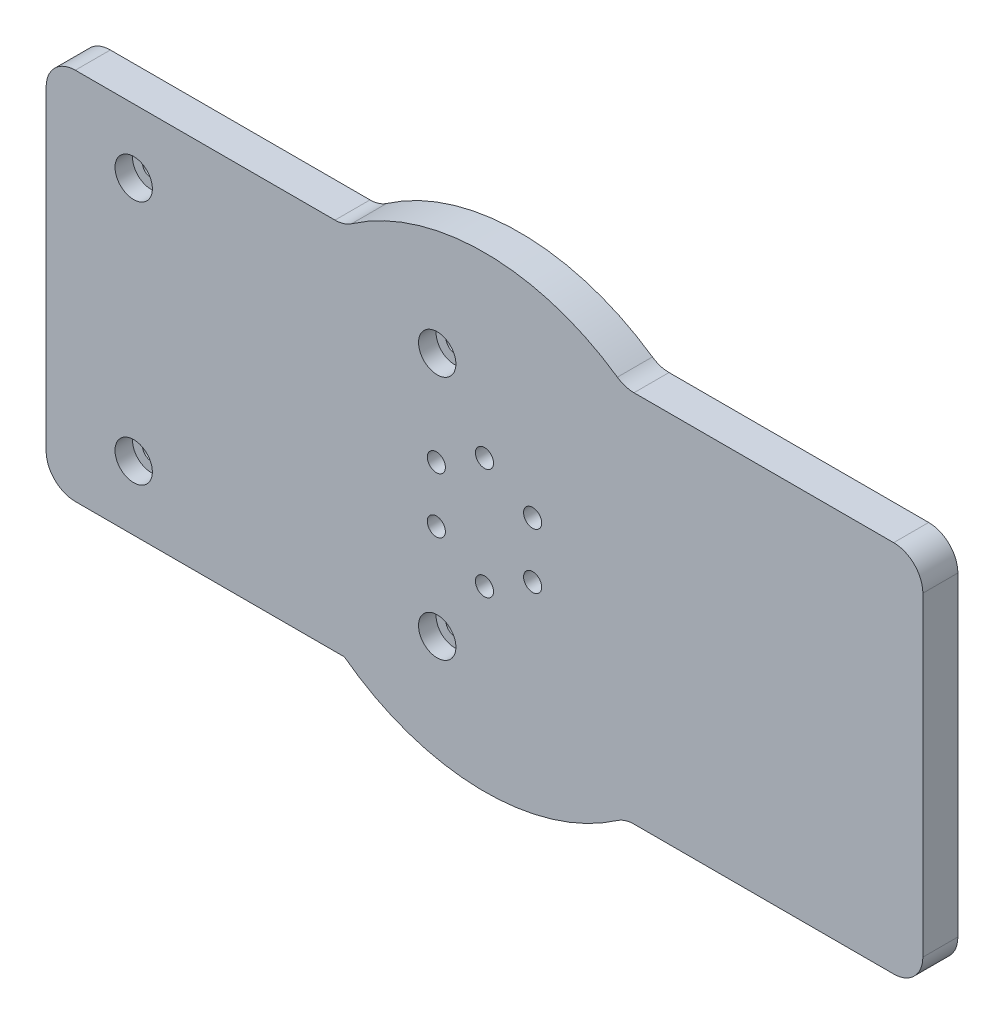
ISO-10303-21;
HEADER;
FILE_DESCRIPTION(('STEP AP214'),'2;1');
FILE_NAME('part.step','',(''),(''),'','','');
FILE_SCHEMA(('AUTOMOTIVE_DESIGN { 1 0 10303 214 1 1 1 1 }'));
ENDSEC;
DATA;
#1=APPLICATION_CONTEXT('core data for automotive mechanical design processes');
#2=APPLICATION_PROTOCOL_DEFINITION('international standard','automotive_design',2000,#1);
#3=PRODUCT_CONTEXT('',#1,'mechanical');
#4=PRODUCT('Part','Part','',(#3));
#5=PRODUCT_RELATED_PRODUCT_CATEGORY('part','',(#4));
#6=PRODUCT_DEFINITION_FORMATION('','',#4);
#7=PRODUCT_DEFINITION_CONTEXT('part definition',#1,'design');
#8=PRODUCT_DEFINITION('design','',#6,#7);
#9=PRODUCT_DEFINITION_SHAPE('','',#8);
#10=(LENGTH_UNIT() NAMED_UNIT(*) SI_UNIT(.MILLI.,.METRE.));
#11=(NAMED_UNIT(*) PLANE_ANGLE_UNIT() SI_UNIT($,.RADIAN.));
#12=(NAMED_UNIT(*) SI_UNIT($,.STERADIAN.) SOLID_ANGLE_UNIT());
#13=UNCERTAINTY_MEASURE_WITH_UNIT(LENGTH_MEASURE(1.E-05),#10,'distance_accuracy_value','');
#14=(GEOMETRIC_REPRESENTATION_CONTEXT(3) GLOBAL_UNCERTAINTY_ASSIGNED_CONTEXT((#13)) GLOBAL_UNIT_ASSIGNED_CONTEXT((#10,
#11,#12)) REPRESENTATION_CONTEXT('',''));
#15=CARTESIAN_POINT('',(0.,0.,0.));
#16=DIRECTION('',(0.,0.,1.));
#17=DIRECTION('',(1.,0.,0.));
#18=AXIS2_PLACEMENT_3D('',#15,#16,#17);
#19=CARTESIAN_POINT('',(15.,53.,0.));
#20=DIRECTION('',(0.,0.,1.));
#21=DIRECTION('',(1.,0.,0.));
#22=AXIS2_PLACEMENT_3D('',#19,#20,#21);
#23=CYLINDRICAL_SURFACE('',#22,1.5);
#24=CARTESIAN_POINT('',(15.,53.,0.));
#25=DIRECTION('',(0.,0.,1.));
#26=DIRECTION('',(1.,0.,0.));
#27=AXIS2_PLACEMENT_3D('',#24,#25,#26);
#28=CIRCLE('',#27,1.5);
#29=CARTESIAN_POINT('',(16.5,53.,0.));
#30=VERTEX_POINT('',#29);
#31=EDGE_CURVE('E176',#30,#30,#28,.T.);
#32=ORIENTED_EDGE('',*,*,#31,.F.);
#33=EDGE_LOOP('',(#32));
#34=FACE_BOUND('',#33,.T.);
#35=CARTESIAN_POINT('',(15.,53.,3.));
#36=DIRECTION('',(0.,0.,1.));
#37=DIRECTION('',(1.,0.,0.));
#38=AXIS2_PLACEMENT_3D('',#35,#36,#37);
#39=CIRCLE('',#38,1.5);
#40=CARTESIAN_POINT('',(16.5,53.,3.));
#41=VERTEX_POINT('',#40);
#42=EDGE_CURVE('E44',#41,#41,#39,.F.);
#43=ORIENTED_EDGE('',*,*,#42,.F.);
#44=EDGE_LOOP('',(#43));
#45=FACE_BOUND('',#44,.T.);
#46=ADVANCED_FACE('F40',(#34,#45),#23,.F.);
#47=CARTESIAN_POINT('',(15.,11.,0.));
#48=DIRECTION('',(0.,0.,1.));
#49=DIRECTION('',(1.,0.,0.));
#50=AXIS2_PLACEMENT_3D('',#47,#48,#49);
#51=CYLINDRICAL_SURFACE('',#50,1.5);
#52=CARTESIAN_POINT('',(15.,11.,0.));
#53=DIRECTION('',(0.,0.,1.));
#54=DIRECTION('',(1.,0.,0.));
#55=AXIS2_PLACEMENT_3D('',#52,#53,#54);
#56=CIRCLE('',#55,1.5);
#57=CARTESIAN_POINT('',(16.5,11.,0.));
#58=VERTEX_POINT('',#57);
#59=EDGE_CURVE('E173',#58,#58,#56,.T.);
#60=ORIENTED_EDGE('',*,*,#59,.F.);
#61=EDGE_LOOP('',(#60));
#62=FACE_BOUND('',#61,.T.);
#63=CARTESIAN_POINT('',(15.,11.,3.));
#64=DIRECTION('',(0.,0.,1.));
#65=DIRECTION('',(1.,0.,0.));
#66=AXIS2_PLACEMENT_3D('',#63,#64,#65);
#67=CIRCLE('',#66,1.5);
#68=CARTESIAN_POINT('',(16.5,11.,3.));
#69=VERTEX_POINT('',#68);
#70=EDGE_CURVE('E306',#69,#69,#67,.F.);
#71=ORIENTED_EDGE('',*,*,#70,.F.);
#72=EDGE_LOOP('',(#71));
#73=FACE_BOUND('',#72,.T.);
#74=ADVANCED_FACE('F393',(#62,#73),#51,.F.);
#75=CARTESIAN_POINT('',(67.,11.,0.));
#76=DIRECTION('',(0.,0.,1.));
#77=DIRECTION('',(1.,0.,0.));
#78=AXIS2_PLACEMENT_3D('',#75,#76,#77);
#79=CYLINDRICAL_SURFACE('',#78,1.5);
#80=CARTESIAN_POINT('',(67.,11.,0.));
#81=DIRECTION('',(0.,0.,1.));
#82=DIRECTION('',(1.,0.,0.));
#83=AXIS2_PLACEMENT_3D('',#80,#81,#82);
#84=CIRCLE('',#83,1.5);
#85=CARTESIAN_POINT('',(68.5,11.,0.));
#86=VERTEX_POINT('',#85);
#87=EDGE_CURVE('E311',#86,#86,#84,.T.);
#88=ORIENTED_EDGE('',*,*,#87,.F.);
#89=EDGE_LOOP('',(#88));
#90=FACE_BOUND('',#89,.T.);
#91=CARTESIAN_POINT('',(67.,11.,3.));
#92=DIRECTION('',(0.,0.,1.));
#93=DIRECTION('',(1.,0.,0.));
#94=AXIS2_PLACEMENT_3D('',#91,#92,#93);
#95=CIRCLE('',#94,1.5);
#96=CARTESIAN_POINT('',(68.5,11.,3.));
#97=VERTEX_POINT('',#96);
#98=EDGE_CURVE('E303',#97,#97,#95,.F.);
#99=ORIENTED_EDGE('',*,*,#98,.F.);
#100=EDGE_LOOP('',(#99));
#101=FACE_BOUND('',#100,.T.);
#102=ADVANCED_FACE('F400',(#90,#101),#79,.F.);
#103=CARTESIAN_POINT('',(67.,53.,0.));
#104=DIRECTION('',(0.,0.,1.));
#105=DIRECTION('',(1.,0.,0.));
#106=AXIS2_PLACEMENT_3D('',#103,#104,#105);
#107=CYLINDRICAL_SURFACE('',#106,1.5);
#108=CARTESIAN_POINT('',(67.,53.,0.));
#109=DIRECTION('',(0.,0.,1.));
#110=DIRECTION('',(1.,0.,0.));
#111=AXIS2_PLACEMENT_3D('',#108,#109,#110);
#112=CIRCLE('',#111,1.5);
#113=CARTESIAN_POINT('',(68.5,53.,0.));
#114=VERTEX_POINT('',#113);
#115=EDGE_CURVE('E315',#114,#114,#112,.T.);
#116=ORIENTED_EDGE('',*,*,#115,.F.);
#117=EDGE_LOOP('',(#116));
#118=FACE_BOUND('',#117,.T.);
#119=CARTESIAN_POINT('',(67.,53.,3.));
#120=DIRECTION('',(0.,0.,1.));
#121=DIRECTION('',(1.,0.,0.));
#122=AXIS2_PLACEMENT_3D('',#119,#120,#121);
#123=CIRCLE('',#122,1.5);
#124=CARTESIAN_POINT('',(68.5,53.,3.));
#125=VERTEX_POINT('',#124);
#126=EDGE_CURVE('E300',#125,#125,#123,.F.);
#127=ORIENTED_EDGE('',*,*,#126,.F.);
#128=EDGE_LOOP('',(#127));
#129=FACE_BOUND('',#128,.T.);
#130=ADVANCED_FACE('F453',(#118,#129),#107,.F.);
#131=CARTESIAN_POINT('',(0.,0.,6.));
#132=DIRECTION('',(1.,0.,0.));
#133=DIRECTION('',(0.,0.,-1.));
#134=AXIS2_PLACEMENT_3D('',#131,#132,#133);
#135=PLANE('',#134);
#136=DIRECTION('',(0.,-1.,0.));
#137=VECTOR('',#136,1.);
#138=CARTESIAN_POINT('',(0.,0.,0.));
#139=LINE('',#138,#137);
#140=CARTESIAN_POINT('',(0.,59.,0.));
#141=VERTEX_POINT('',#140);
#142=CARTESIAN_POINT('',(0.,5.,0.));
#143=VERTEX_POINT('',#142);
#144=EDGE_CURVE('E231',#141,#143,#139,.T.);
#145=ORIENTED_EDGE('',*,*,#144,.T.);
#146=DIRECTION('',(0.,0.,-1.));
#147=VECTOR('',#146,1.);
#148=CARTESIAN_POINT('',(0.,5.,6.));
#149=LINE('',#148,#147);
#150=CARTESIAN_POINT('',(0.,5.,6.));
#151=VERTEX_POINT('',#150);
#152=EDGE_CURVE('E49',#143,#151,#149,.F.);
#153=ORIENTED_EDGE('',*,*,#152,.T.);
#154=DIRECTION('',(0.,-1.,0.));
#155=VECTOR('',#154,1.);
#156=CARTESIAN_POINT('',(0.,0.,6.));
#157=LINE('',#156,#155);
#158=CARTESIAN_POINT('',(0.,59.,6.));
#159=VERTEX_POINT('',#158);
#160=EDGE_CURVE('E218',#159,#151,#157,.T.);
#161=ORIENTED_EDGE('',*,*,#160,.F.);
#162=DIRECTION('',(0.,0.,-1.));
#163=VECTOR('',#162,1.);
#164=CARTESIAN_POINT('',(0.,59.,6.));
#165=LINE('',#164,#163);
#166=EDGE_CURVE('E268',#159,#141,#165,.T.);
#167=ORIENTED_EDGE('',*,*,#166,.T.);
#168=EDGE_LOOP('',(#145,#153,#161,#167));
#169=FACE_BOUND('',#168,.T.);
#170=ADVANCED_FACE('F359',(#169),#135,.F.);
#171=CARTESIAN_POINT('',(0.,0.,6.));
#172=DIRECTION('',(0.,0.,-1.));
#173=DIRECTION('',(-1.,0.,0.));
#174=AXIS2_PLACEMENT_3D('',#171,#172,#173);
#175=PLANE('',#174);
#176=CARTESIAN_POINT('',(67.,53.,6.));
#177=DIRECTION('',(0.,0.,1.));
#178=DIRECTION('',(1.,0.,0.));
#179=AXIS2_PLACEMENT_3D('',#176,#177,#178);
#180=CIRCLE('',#179,3.2);
#181=CARTESIAN_POINT('',(70.2,53.,6.));
#182=VERTEX_POINT('',#181);
#183=EDGE_CURVE('E335',#182,#182,#180,.T.);
#184=ORIENTED_EDGE('',*,*,#183,.F.);
#185=EDGE_LOOP('',(#184));
#186=FACE_BOUND('',#185,.T.);
#187=CARTESIAN_POINT('',(15.,11.,6.));
#188=DIRECTION('',(0.,0.,1.));
#189=DIRECTION('',(1.,0.,0.));
#190=AXIS2_PLACEMENT_3D('',#187,#188,#189);
#191=CIRCLE('',#190,3.2);
#192=CARTESIAN_POINT('',(18.2,11.,6.));
#193=VERTEX_POINT('',#192);
#194=EDGE_CURVE('E328',#193,#193,#191,.T.);
#195=ORIENTED_EDGE('',*,*,#194,.F.);
#196=EDGE_LOOP('',(#195));
#197=FACE_BOUND('',#196,.T.);
#198=CARTESIAN_POINT('',(67.,11.,6.));
#199=DIRECTION('',(0.,0.,1.));
#200=DIRECTION('',(1.,0.,0.));
#201=AXIS2_PLACEMENT_3D('',#198,#199,#200);
#202=CIRCLE('',#201,3.2);
#203=CARTESIAN_POINT('',(70.2,11.,6.));
#204=VERTEX_POINT('',#203);
#205=EDGE_CURVE('E340',#204,#204,#202,.T.);
#206=ORIENTED_EDGE('',*,*,#205,.F.);
#207=EDGE_LOOP('',(#206));
#208=FACE_BOUND('',#207,.T.);
#209=CARTESIAN_POINT('',(15.,53.,6.));
#210=DIRECTION('',(0.,0.,1.));
#211=DIRECTION('',(1.,0.,0.));
#212=AXIS2_PLACEMENT_3D('',#209,#210,#211);
#213=CIRCLE('',#212,3.2);
#214=CARTESIAN_POINT('',(18.2,53.,6.));
#215=VERTEX_POINT('',#214);
#216=EDGE_CURVE('E322',#215,#215,#213,.T.);
#217=ORIENTED_EDGE('',*,*,#216,.F.);
#218=EDGE_LOOP('',(#217));
#219=FACE_BOUND('',#218,.T.);
#220=CARTESIAN_POINT('',(83.348891971047,36.7625000000003,6.));
#221=DIRECTION('',(0.,0.,1.));
#222=DIRECTION('',(1.,0.,0.));
#223=AXIS2_PLACEMENT_3D('',#220,#221,#222);
#224=CIRCLE('',#223,1.55);
#225=CARTESIAN_POINT('',(84.898891971047,36.7625000000003,6.));
#226=VERTEX_POINT('',#225);
#227=EDGE_CURVE('E197',#226,#226,#224,.T.);
#228=ORIENTED_EDGE('',*,*,#227,.F.);
#229=EDGE_LOOP('',(#228));
#230=FACE_BOUND('',#229,.T.);
#231=CARTESIAN_POINT('',(83.3488919710474,27.2375000000003,6.));
#232=DIRECTION('',(0.,0.,1.));
#233=DIRECTION('',(1.,0.,0.));
#234=AXIS2_PLACEMENT_3D('',#231,#232,#233);
#235=CIRCLE('',#234,1.55);
#236=CARTESIAN_POINT('',(84.8988919710474,27.2375000000003,6.));
#237=VERTEX_POINT('',#236);
#238=EDGE_CURVE('E203',#237,#237,#235,.T.);
#239=ORIENTED_EDGE('',*,*,#238,.F.);
#240=EDGE_LOOP('',(#239));
#241=FACE_BOUND('',#240,.T.);
#242=CARTESIAN_POINT('',(75.1000000000007,22.475,6.));
#243=DIRECTION('',(0.,0.,1.));
#244=DIRECTION('',(1.,0.,0.));
#245=AXIS2_PLACEMENT_3D('',#242,#243,#244);
#246=CIRCLE('',#245,1.54999999999999);
#247=CARTESIAN_POINT('',(76.6500000000007,22.475,6.));
#248=VERTEX_POINT('',#247);
#249=EDGE_CURVE('E209',#248,#248,#246,.T.);
#250=ORIENTED_EDGE('',*,*,#249,.F.);
#251=EDGE_LOOP('',(#250));
#252=FACE_BOUND('',#251,.T.);
#253=CARTESIAN_POINT('',(66.8511080289538,27.2374999999997,6.));
#254=DIRECTION('',(0.,0.,1.));
#255=DIRECTION('',(1.,0.,0.));
#256=AXIS2_PLACEMENT_3D('',#253,#254,#255);
#257=CIRCLE('',#256,1.54999999999999);
#258=CARTESIAN_POINT('',(68.4011080289538,27.2374999999997,6.));
#259=VERTEX_POINT('',#258);
#260=EDGE_CURVE('E192',#259,#259,#257,.T.);
#261=ORIENTED_EDGE('',*,*,#260,.F.);
#262=EDGE_LOOP('',(#261));
#263=FACE_BOUND('',#262,.T.);
#264=CARTESIAN_POINT('',(66.8511080289535,36.7624999999998,6.));
#265=DIRECTION('',(0.,0.,1.));
#266=DIRECTION('',(1.,0.,0.));
#267=AXIS2_PLACEMENT_3D('',#264,#265,#266);
#268=CIRCLE('',#267,1.55);
#269=CARTESIAN_POINT('',(68.4011080289535,36.7624999999998,6.));
#270=VERTEX_POINT('',#269);
#271=EDGE_CURVE('E181',#270,#270,#268,.T.);
#272=ORIENTED_EDGE('',*,*,#271,.F.);
#273=EDGE_LOOP('',(#272));
#274=FACE_BOUND('',#273,.T.);
#275=CARTESIAN_POINT('',(75.1,41.525,6.));
#276=DIRECTION('',(0.,0.,1.));
#277=DIRECTION('',(1.,0.,0.));
#278=AXIS2_PLACEMENT_3D('',#275,#276,#277);
#279=CIRCLE('',#278,1.54999999999999);
#280=CARTESIAN_POINT('',(76.65,41.525,6.));
#281=VERTEX_POINT('',#280);
#282=EDGE_CURVE('E185',#281,#281,#279,.T.);
#283=ORIENTED_EDGE('',*,*,#282,.F.);
#284=EDGE_LOOP('',(#283));
#285=FACE_BOUND('',#284,.T.);
#286=ORIENTED_EDGE('',*,*,#160,.T.);
#287=CARTESIAN_POINT('',(5.,5.,6.));
#288=DIRECTION('',(0.,0.,-1.));
#289=DIRECTION('',(-1.,0.,0.));
#290=AXIS2_PLACEMENT_3D('',#287,#288,#289);
#291=CIRCLE('',#290,5.);
#292=CARTESIAN_POINT('',(5.,0.,6.));
#293=VERTEX_POINT('',#292);
#294=EDGE_CURVE('E11',#151,#293,#291,.F.);
#295=ORIENTED_EDGE('',*,*,#294,.T.);
#296=DIRECTION('',(-1.,0.,0.));
#297=VECTOR('',#296,1.);
#298=CARTESIAN_POINT('',(0.,0.,6.));
#299=LINE('',#298,#297);
#300=CARTESIAN_POINT('',(51.1,0.,6.));
#301=VERTEX_POINT('',#300);
#302=EDGE_CURVE('E167',#301,#293,#299,.T.);
#303=ORIENTED_EDGE('',*,*,#302,.F.);
#304=CARTESIAN_POINT('',(75.1,32.,6.));
#305=DIRECTION('',(0.,0.,1.));
#306=DIRECTION('',(1.,0.,0.));
#307=AXIS2_PLACEMENT_3D('',#304,#305,#306);
#308=CIRCLE('',#307,40.);
#309=CARTESIAN_POINT('',(97.8666639553168,-0.888888888888897,6.));
#310=VERTEX_POINT('',#309);
#311=EDGE_CURVE('E163',#301,#310,#308,.T.);
#312=ORIENTED_EDGE('',*,*,#311,.T.);
#313=CARTESIAN_POINT('',(100.712496949731,-5.,6.));
#314=DIRECTION('',(0.,0.,-1.));
#315=DIRECTION('',(-1.,0.,0.));
#316=AXIS2_PLACEMENT_3D('',#313,#314,#315);
#317=CIRCLE('',#316,5.);
#318=CARTESIAN_POINT('',(100.712496949731,0.,6.));
#319=VERTEX_POINT('',#318);
#320=EDGE_CURVE('E295',#310,#319,#317,.T.);
#321=ORIENTED_EDGE('',*,*,#320,.T.);
#322=DIRECTION('',(1.,0.,0.));
#323=VECTOR('',#322,1.);
#324=CARTESIAN_POINT('',(0.,0.,6.));
#325=LINE('',#324,#323);
#326=CARTESIAN_POINT('',(145.2,0.,6.));
#327=VERTEX_POINT('',#326);
#328=EDGE_CURVE('E220',#319,#327,#325,.T.);
#329=ORIENTED_EDGE('',*,*,#328,.T.);
#330=CARTESIAN_POINT('',(145.2,5.,6.));
#331=DIRECTION('',(0.,0.,-1.));
#332=DIRECTION('',(-1.,0.,0.));
#333=AXIS2_PLACEMENT_3D('',#330,#331,#332);
#334=CIRCLE('',#333,5.);
#335=CARTESIAN_POINT('',(150.2,5.,6.));
#336=VERTEX_POINT('',#335);
#337=EDGE_CURVE('E260',#327,#336,#334,.F.);
#338=ORIENTED_EDGE('',*,*,#337,.T.);
#339=DIRECTION('',(0.,1.,0.));
#340=VECTOR('',#339,1.);
#341=CARTESIAN_POINT('',(150.2,0.,6.));
#342=LINE('',#341,#340);
#343=CARTESIAN_POINT('',(150.2,59.,6.));
#344=VERTEX_POINT('',#343);
#345=EDGE_CURVE('E223',#336,#344,#342,.T.);
#346=ORIENTED_EDGE('',*,*,#345,.T.);
#347=CARTESIAN_POINT('',(145.2,59.,6.));
#348=DIRECTION('',(0.,0.,-1.));
#349=DIRECTION('',(-1.,0.,0.));
#350=AXIS2_PLACEMENT_3D('',#347,#348,#349);
#351=CIRCLE('',#350,5.);
#352=CARTESIAN_POINT('',(145.2,64.,6.));
#353=VERTEX_POINT('',#352);
#354=EDGE_CURVE('E258',#344,#353,#351,.F.);
#355=ORIENTED_EDGE('',*,*,#354,.T.);
#356=DIRECTION('',(-1.,0.,0.));
#357=VECTOR('',#356,1.);
#358=CARTESIAN_POINT('',(0.,64.,6.));
#359=LINE('',#358,#357);
#360=CARTESIAN_POINT('',(100.712496949731,64.,6.));
#361=VERTEX_POINT('',#360);
#362=EDGE_CURVE('E227',#353,#361,#359,.T.);
#363=ORIENTED_EDGE('',*,*,#362,.T.);
#364=CARTESIAN_POINT('',(100.712496949731,69.,6.));
#365=DIRECTION('',(0.,0.,-1.));
#366=DIRECTION('',(-1.,0.,0.));
#367=AXIS2_PLACEMENT_3D('',#364,#365,#366);
#368=CIRCLE('',#367,5.);
#369=CARTESIAN_POINT('',(97.8666639553168,64.8888888888889,6.));
#370=VERTEX_POINT('',#369);
#371=EDGE_CURVE('E290',#361,#370,#368,.T.);
#372=ORIENTED_EDGE('',*,*,#371,.T.);
#373=CARTESIAN_POINT('',(52.3333360446832,64.8888888888889,6.));
#374=VERTEX_POINT('',#373);
#375=EDGE_CURVE('E157',#370,#374,#308,.T.);
#376=ORIENTED_EDGE('',*,*,#375,.T.);
#377=CARTESIAN_POINT('',(49.4875030502686,69.,6.));
#378=DIRECTION('',(0.,0.,-1.));
#379=DIRECTION('',(-1.,0.,0.));
#380=AXIS2_PLACEMENT_3D('',#377,#378,#379);
#381=CIRCLE('',#380,5.);
#382=CARTESIAN_POINT('',(49.4875030502686,64.,6.));
#383=VERTEX_POINT('',#382);
#384=EDGE_CURVE('E288',#374,#383,#381,.T.);
#385=ORIENTED_EDGE('',*,*,#384,.T.);
#386=CARTESIAN_POINT('',(5.,64.,6.));
#387=VERTEX_POINT('',#386);
#388=EDGE_CURVE('E226',#383,#387,#359,.T.);
#389=ORIENTED_EDGE('',*,*,#388,.T.);
#390=CARTESIAN_POINT('',(5.,59.,6.));
#391=DIRECTION('',(0.,0.,-1.));
#392=DIRECTION('',(-1.,0.,0.));
#393=AXIS2_PLACEMENT_3D('',#390,#391,#392);
#394=CIRCLE('',#393,5.);
#395=EDGE_CURVE('E256',#387,#159,#394,.F.);
#396=ORIENTED_EDGE('',*,*,#395,.T.);
#397=EDGE_LOOP('',(#286,#295,#303,#312,#321,#329,#338,#346,#355,#363,#372,#376,#385,#389,#396));
#398=FACE_BOUND('',#397,.T.);
#399=ADVANCED_FACE('F356',(#186,#197,#208,#219,#230,#241,#252,#263,#274,#285,#398),#175,.F.);
#400=CARTESIAN_POINT('',(0.,0.,0.));
#401=DIRECTION('',(0.,0.,-1.));
#402=DIRECTION('',(-1.,0.,0.));
#403=AXIS2_PLACEMENT_3D('',#400,#401,#402);
#404=PLANE('',#403);
#405=ORIENTED_EDGE('',*,*,#115,.T.);
#406=EDGE_LOOP('',(#405));
#407=FACE_BOUND('',#406,.T.);
#408=ORIENTED_EDGE('',*,*,#87,.T.);
#409=EDGE_LOOP('',(#408));
#410=FACE_BOUND('',#409,.T.);
#411=ORIENTED_EDGE('',*,*,#59,.T.);
#412=EDGE_LOOP('',(#411));
#413=FACE_BOUND('',#412,.T.);
#414=ORIENTED_EDGE('',*,*,#31,.T.);
#415=EDGE_LOOP('',(#414));
#416=FACE_BOUND('',#415,.T.);
#417=CARTESIAN_POINT('',(75.1,41.525,0.));
#418=DIRECTION('',(0.,0.,1.));
#419=DIRECTION('',(1.,0.,0.));
#420=AXIS2_PLACEMENT_3D('',#417,#418,#419);
#421=CIRCLE('',#420,1.54999999999999);
#422=CARTESIAN_POINT('',(76.65,41.525,0.));
#423=VERTEX_POINT('',#422);
#424=EDGE_CURVE('E182',#423,#423,#421,.T.);
#425=ORIENTED_EDGE('',*,*,#424,.T.);
#426=EDGE_LOOP('',(#425));
#427=FACE_BOUND('',#426,.T.);
#428=CARTESIAN_POINT('',(66.8511080289535,36.7624999999998,0.));
#429=DIRECTION('',(0.,0.,1.));
#430=DIRECTION('',(1.,0.,0.));
#431=AXIS2_PLACEMENT_3D('',#428,#429,#430);
#432=CIRCLE('',#431,1.55);
#433=CARTESIAN_POINT('',(68.4011080289535,36.7624999999998,0.));
#434=VERTEX_POINT('',#433);
#435=EDGE_CURVE('E189',#434,#434,#432,.T.);
#436=ORIENTED_EDGE('',*,*,#435,.T.);
#437=EDGE_LOOP('',(#436));
#438=FACE_BOUND('',#437,.T.);
#439=CARTESIAN_POINT('',(66.8511080289538,27.2374999999997,0.));
#440=DIRECTION('',(0.,0.,1.));
#441=DIRECTION('',(1.,0.,0.));
#442=AXIS2_PLACEMENT_3D('',#439,#440,#441);
#443=CIRCLE('',#442,1.54999999999999);
#444=CARTESIAN_POINT('',(68.4011080289538,27.2374999999997,0.));
#445=VERTEX_POINT('',#444);
#446=EDGE_CURVE('E212',#445,#445,#443,.T.);
#447=ORIENTED_EDGE('',*,*,#446,.T.);
#448=EDGE_LOOP('',(#447));
#449=FACE_BOUND('',#448,.T.);
#450=CARTESIAN_POINT('',(75.1000000000007,22.475,0.));
#451=DIRECTION('',(0.,0.,1.));
#452=DIRECTION('',(1.,0.,0.));
#453=AXIS2_PLACEMENT_3D('',#450,#451,#452);
#454=CIRCLE('',#453,1.54999999999999);
#455=CARTESIAN_POINT('',(76.6500000000007,22.475,0.));
#456=VERTEX_POINT('',#455);
#457=EDGE_CURVE('E206',#456,#456,#454,.T.);
#458=ORIENTED_EDGE('',*,*,#457,.T.);
#459=EDGE_LOOP('',(#458));
#460=FACE_BOUND('',#459,.T.);
#461=CARTESIAN_POINT('',(83.3488919710474,27.2375000000003,0.));
#462=DIRECTION('',(0.,0.,1.));
#463=DIRECTION('',(1.,0.,0.));
#464=AXIS2_PLACEMENT_3D('',#461,#462,#463);
#465=CIRCLE('',#464,1.55);
#466=CARTESIAN_POINT('',(84.8988919710474,27.2375000000003,0.));
#467=VERTEX_POINT('',#466);
#468=EDGE_CURVE('E200',#467,#467,#465,.T.);
#469=ORIENTED_EDGE('',*,*,#468,.T.);
#470=EDGE_LOOP('',(#469));
#471=FACE_BOUND('',#470,.T.);
#472=CARTESIAN_POINT('',(83.348891971047,36.7625000000003,0.));
#473=DIRECTION('',(0.,0.,1.));
#474=DIRECTION('',(1.,0.,0.));
#475=AXIS2_PLACEMENT_3D('',#472,#473,#474);
#476=CIRCLE('',#475,1.55);
#477=CARTESIAN_POINT('',(84.898891971047,36.7625000000003,0.));
#478=VERTEX_POINT('',#477);
#479=EDGE_CURVE('E188',#478,#478,#476,.T.);
#480=ORIENTED_EDGE('',*,*,#479,.T.);
#481=EDGE_LOOP('',(#480));
#482=FACE_BOUND('',#481,.T.);
#483=DIRECTION('',(-1.,0.,0.));
#484=VECTOR('',#483,1.);
#485=CARTESIAN_POINT('',(0.,0.,0.));
#486=LINE('',#485,#484);
#487=CARTESIAN_POINT('',(51.1,0.,0.));
#488=VERTEX_POINT('',#487);
#489=CARTESIAN_POINT('',(5.,0.,0.));
#490=VERTEX_POINT('',#489);
#491=EDGE_CURVE('E151',#488,#490,#486,.T.);
#492=ORIENTED_EDGE('',*,*,#491,.T.);
#493=CARTESIAN_POINT('',(5.,5.,0.));
#494=DIRECTION('',(0.,0.,-1.));
#495=DIRECTION('',(-1.,0.,0.));
#496=AXIS2_PLACEMENT_3D('',#493,#494,#495);
#497=CIRCLE('',#496,5.);
#498=EDGE_CURVE('E64',#490,#143,#497,.T.);
#499=ORIENTED_EDGE('',*,*,#498,.T.);
#500=ORIENTED_EDGE('',*,*,#144,.F.);
#501=CARTESIAN_POINT('',(5.,59.,0.));
#502=DIRECTION('',(0.,0.,-1.));
#503=DIRECTION('',(-1.,0.,0.));
#504=AXIS2_PLACEMENT_3D('',#501,#502,#503);
#505=CIRCLE('',#504,5.);
#506=CARTESIAN_POINT('',(5.,64.,0.));
#507=VERTEX_POINT('',#506);
#508=EDGE_CURVE('E245',#141,#507,#505,.T.);
#509=ORIENTED_EDGE('',*,*,#508,.T.);
#510=DIRECTION('',(-1.,0.,0.));
#511=VECTOR('',#510,1.);
#512=CARTESIAN_POINT('',(0.,64.,0.));
#513=LINE('',#512,#511);
#514=CARTESIAN_POINT('',(49.4875030502686,64.,0.));
#515=VERTEX_POINT('',#514);
#516=EDGE_CURVE('E238',#515,#507,#513,.T.);
#517=ORIENTED_EDGE('',*,*,#516,.F.);
#518=CARTESIAN_POINT('',(49.4875030502686,69.,0.));
#519=DIRECTION('',(0.,0.,-1.));
#520=DIRECTION('',(-1.,0.,0.));
#521=AXIS2_PLACEMENT_3D('',#518,#519,#520);
#522=CIRCLE('',#521,5.);
#523=CARTESIAN_POINT('',(52.3333360446832,64.8888888888889,0.));
#524=VERTEX_POINT('',#523);
#525=EDGE_CURVE('E286',#515,#524,#522,.F.);
#526=ORIENTED_EDGE('',*,*,#525,.T.);
#527=CARTESIAN_POINT('',(75.1,32.,0.));
#528=DIRECTION('',(0.,0.,1.));
#529=DIRECTION('',(1.,0.,0.));
#530=AXIS2_PLACEMENT_3D('',#527,#528,#529);
#531=CIRCLE('',#530,40.);
#532=CARTESIAN_POINT('',(97.8666639553168,64.8888888888889,0.));
#533=VERTEX_POINT('',#532);
#534=EDGE_CURVE('E156',#533,#524,#531,.T.);
#535=ORIENTED_EDGE('',*,*,#534,.F.);
#536=CARTESIAN_POINT('',(100.712496949731,69.,0.));
#537=DIRECTION('',(0.,0.,-1.));
#538=DIRECTION('',(-1.,0.,0.));
#539=AXIS2_PLACEMENT_3D('',#536,#537,#538);
#540=CIRCLE('',#539,5.);
#541=CARTESIAN_POINT('',(100.712496949731,64.,0.));
#542=VERTEX_POINT('',#541);
#543=EDGE_CURVE('E292',#533,#542,#540,.F.);
#544=ORIENTED_EDGE('',*,*,#543,.T.);
#545=CARTESIAN_POINT('',(145.2,64.,0.));
#546=VERTEX_POINT('',#545);
#547=EDGE_CURVE('E221',#546,#542,#513,.T.);
#548=ORIENTED_EDGE('',*,*,#547,.F.);
#549=CARTESIAN_POINT('',(145.2,59.,0.));
#550=DIRECTION('',(0.,0.,-1.));
#551=DIRECTION('',(-1.,0.,0.));
#552=AXIS2_PLACEMENT_3D('',#549,#550,#551);
#553=CIRCLE('',#552,5.);
#554=CARTESIAN_POINT('',(150.2,59.,0.));
#555=VERTEX_POINT('',#554);
#556=EDGE_CURVE('E248',#546,#555,#553,.T.);
#557=ORIENTED_EDGE('',*,*,#556,.T.);
#558=DIRECTION('',(0.,1.,0.));
#559=VECTOR('',#558,1.);
#560=CARTESIAN_POINT('',(150.2,0.,0.));
#561=LINE('',#560,#559);
#562=CARTESIAN_POINT('',(150.2,5.,0.));
#563=VERTEX_POINT('',#562);
#564=EDGE_CURVE('E235',#563,#555,#561,.T.);
#565=ORIENTED_EDGE('',*,*,#564,.F.);
#566=CARTESIAN_POINT('',(145.2,5.,0.));
#567=DIRECTION('',(0.,0.,-1.));
#568=DIRECTION('',(-1.,0.,0.));
#569=AXIS2_PLACEMENT_3D('',#566,#567,#568);
#570=CIRCLE('',#569,5.);
#571=CARTESIAN_POINT('',(145.2,0.,0.));
#572=VERTEX_POINT('',#571);
#573=EDGE_CURVE('E250',#563,#572,#570,.T.);
#574=ORIENTED_EDGE('',*,*,#573,.T.);
#575=DIRECTION('',(1.,0.,0.));
#576=VECTOR('',#575,1.);
#577=CARTESIAN_POINT('',(0.,0.,0.));
#578=LINE('',#577,#576);
#579=CARTESIAN_POINT('',(100.712496949731,0.,0.));
#580=VERTEX_POINT('',#579);
#581=EDGE_CURVE('E233',#580,#572,#578,.T.);
#582=ORIENTED_EDGE('',*,*,#581,.F.);
#583=CARTESIAN_POINT('',(100.712496949731,-5.,0.));
#584=DIRECTION('',(0.,0.,-1.));
#585=DIRECTION('',(-1.,0.,0.));
#586=AXIS2_PLACEMENT_3D('',#583,#584,#585);
#587=CIRCLE('',#586,5.);
#588=CARTESIAN_POINT('',(97.8666639553168,-0.888888888888897,0.));
#589=VERTEX_POINT('',#588);
#590=EDGE_CURVE('E153',#580,#589,#587,.F.);
#591=ORIENTED_EDGE('',*,*,#590,.T.);
#592=EDGE_CURVE('E147',#488,#589,#531,.T.);
#593=ORIENTED_EDGE('',*,*,#592,.F.);
#594=EDGE_LOOP('',(#492,#499,#500,#509,#517,#526,#535,#544,#548,#557,#565,#574,#582,#591,#593));
#595=FACE_BOUND('',#594,.T.);
#596=ADVANCED_FACE('F149',(#407,#410,#413,#416,#427,#438,#449,#460,#471,#482,#595),#404,.T.);
#597=CARTESIAN_POINT('',(0.,64.,6.));
#598=DIRECTION('',(0.,-1.,0.));
#599=DIRECTION('',(0.,0.,-1.));
#600=AXIS2_PLACEMENT_3D('',#597,#598,#599);
#601=PLANE('',#600);
#602=ORIENTED_EDGE('',*,*,#547,.T.);
#603=DIRECTION('',(0.,0.,1.));
#604=VECTOR('',#603,1.);
#605=CARTESIAN_POINT('',(100.712496949731,64.,6.));
#606=LINE('',#605,#604);
#607=EDGE_CURVE('E278',#542,#361,#606,.T.);
#608=ORIENTED_EDGE('',*,*,#607,.T.);
#609=ORIENTED_EDGE('',*,*,#362,.F.);
#610=DIRECTION('',(0.,0.,-1.));
#611=VECTOR('',#610,1.);
#612=CARTESIAN_POINT('',(145.2,64.,6.));
#613=LINE('',#612,#611);
#614=EDGE_CURVE('E265',#353,#546,#613,.T.);
#615=ORIENTED_EDGE('',*,*,#614,.T.);
#616=EDGE_LOOP('',(#602,#608,#609,#615));
#617=FACE_BOUND('',#616,.T.);
#618=ADVANCED_FACE('F436',(#617),#601,.F.);
#619=CARTESIAN_POINT('',(0.,0.,6.));
#620=DIRECTION('',(0.,1.,0.));
#621=DIRECTION('',(0.,0.,1.));
#622=AXIS2_PLACEMENT_3D('',#619,#620,#621);
#623=PLANE('',#622);
#624=ORIENTED_EDGE('',*,*,#328,.F.);
#625=DIRECTION('',(0.,0.,1.));
#626=VECTOR('',#625,1.);
#627=CARTESIAN_POINT('',(100.712496949731,0.,6.));
#628=LINE('',#627,#626);
#629=EDGE_CURVE('E281',#319,#580,#628,.F.);
#630=ORIENTED_EDGE('',*,*,#629,.T.);
#631=ORIENTED_EDGE('',*,*,#581,.T.);
#632=DIRECTION('',(0.,0.,-1.));
#633=VECTOR('',#632,1.);
#634=CARTESIAN_POINT('',(145.2,0.,6.));
#635=LINE('',#634,#633);
#636=EDGE_CURVE('E253',#572,#327,#635,.F.);
#637=ORIENTED_EDGE('',*,*,#636,.T.);
#638=EDGE_LOOP('',(#624,#630,#631,#637));
#639=FACE_BOUND('',#638,.T.);
#640=ADVANCED_FACE('F446',(#639),#623,.F.);
#641=CARTESIAN_POINT('',(150.2,0.,6.));
#642=DIRECTION('',(-1.,0.,0.));
#643=DIRECTION('',(0.,0.,1.));
#644=AXIS2_PLACEMENT_3D('',#641,#642,#643);
#645=PLANE('',#644);
#646=ORIENTED_EDGE('',*,*,#345,.F.);
#647=DIRECTION('',(0.,0.,-1.));
#648=VECTOR('',#647,1.);
#649=CARTESIAN_POINT('',(150.2,5.,6.));
#650=LINE('',#649,#648);
#651=EDGE_CURVE('E242',#336,#563,#650,.T.);
#652=ORIENTED_EDGE('',*,*,#651,.T.);
#653=ORIENTED_EDGE('',*,*,#564,.T.);
#654=DIRECTION('',(0.,0.,-1.));
#655=VECTOR('',#654,1.);
#656=CARTESIAN_POINT('',(150.2,59.,6.));
#657=LINE('',#656,#655);
#658=EDGE_CURVE('E230',#555,#344,#657,.F.);
#659=ORIENTED_EDGE('',*,*,#658,.T.);
#660=EDGE_LOOP('',(#646,#652,#653,#659));
#661=FACE_BOUND('',#660,.T.);
#662=ADVANCED_FACE('F442',(#661),#645,.F.);
#663=ORIENTED_EDGE('',*,*,#388,.F.);
#664=DIRECTION('',(0.,0.,1.));
#665=VECTOR('',#664,1.);
#666=CARTESIAN_POINT('',(49.4875030502686,64.,6.));
#667=LINE('',#666,#665);
#668=EDGE_CURVE('E271',#383,#515,#667,.F.);
#669=ORIENTED_EDGE('',*,*,#668,.T.);
#670=ORIENTED_EDGE('',*,*,#516,.T.);
#671=DIRECTION('',(0.,0.,-1.));
#672=VECTOR('',#671,1.);
#673=CARTESIAN_POINT('',(5.,64.,6.));
#674=LINE('',#673,#672);
#675=EDGE_CURVE('E262',#507,#387,#674,.F.);
#676=ORIENTED_EDGE('',*,*,#675,.T.);
#677=EDGE_LOOP('',(#663,#669,#670,#676));
#678=FACE_BOUND('',#677,.T.);
#679=ADVANCED_FACE('F438',(#678),#601,.F.);
#680=CARTESIAN_POINT('',(145.2,5.,6.));
#681=DIRECTION('',(0.,0.,-1.));
#682=DIRECTION('',(-1.,0.,0.));
#683=AXIS2_PLACEMENT_3D('',#680,#681,#682);
#684=CYLINDRICAL_SURFACE('',#683,5.);
#685=ORIENTED_EDGE('',*,*,#337,.F.);
#686=ORIENTED_EDGE('',*,*,#636,.F.);
#687=ORIENTED_EDGE('',*,*,#573,.F.);
#688=ORIENTED_EDGE('',*,*,#651,.F.);
#689=EDGE_LOOP('',(#685,#686,#687,#688));
#690=FACE_BOUND('',#689,.T.);
#691=ADVANCED_FACE('F441',(#690),#684,.T.);
#692=CARTESIAN_POINT('',(145.2,59.,6.));
#693=DIRECTION('',(0.,0.,-1.));
#694=DIRECTION('',(-1.,0.,0.));
#695=AXIS2_PLACEMENT_3D('',#692,#693,#694);
#696=CYLINDRICAL_SURFACE('',#695,5.);
#697=ORIENTED_EDGE('',*,*,#354,.F.);
#698=ORIENTED_EDGE('',*,*,#658,.F.);
#699=ORIENTED_EDGE('',*,*,#556,.F.);
#700=ORIENTED_EDGE('',*,*,#614,.F.);
#701=EDGE_LOOP('',(#697,#698,#699,#700));
#702=FACE_BOUND('',#701,.T.);
#703=ADVANCED_FACE('F456',(#702),#696,.T.);
#704=CARTESIAN_POINT('',(5.,59.,6.));
#705=DIRECTION('',(0.,0.,-1.));
#706=DIRECTION('',(-1.,0.,0.));
#707=AXIS2_PLACEMENT_3D('',#704,#705,#706);
#708=CYLINDRICAL_SURFACE('',#707,5.);
#709=ORIENTED_EDGE('',*,*,#395,.F.);
#710=ORIENTED_EDGE('',*,*,#675,.F.);
#711=ORIENTED_EDGE('',*,*,#508,.F.);
#712=ORIENTED_EDGE('',*,*,#166,.F.);
#713=EDGE_LOOP('',(#709,#710,#711,#712));
#714=FACE_BOUND('',#713,.T.);
#715=ADVANCED_FACE('F433',(#714),#708,.T.);
#716=CARTESIAN_POINT('',(75.1,32.,0.));
#717=DIRECTION('',(0.,0.,1.));
#718=DIRECTION('',(1.,0.,0.));
#719=AXIS2_PLACEMENT_3D('',#716,#717,#718);
#720=CYLINDRICAL_SURFACE('',#719,40.);
#721=ORIENTED_EDGE('',*,*,#592,.T.);
#722=DIRECTION('',(0.,0.,1.));
#723=VECTOR('',#722,1.);
#724=CARTESIAN_POINT('',(97.8666639553168,-0.88888888888889,0.));
#725=LINE('',#724,#723);
#726=EDGE_CURVE('E284',#589,#310,#725,.T.);
#727=ORIENTED_EDGE('',*,*,#726,.T.);
#728=ORIENTED_EDGE('',*,*,#311,.F.);
#729=DIRECTION('',(0.,0.,-1.));
#730=VECTOR('',#729,1.);
#731=CARTESIAN_POINT('',(51.1,0.,10.));
#732=LINE('',#731,#730);
#733=EDGE_CURVE('E160',#301,#488,#732,.T.);
#734=ORIENTED_EDGE('',*,*,#733,.T.);
#735=EDGE_LOOP('',(#721,#727,#728,#734));
#736=FACE_BOUND('',#735,.T.);
#737=ADVANCED_FACE('F161',(#736),#720,.T.);
#738=ORIENTED_EDGE('',*,*,#534,.T.);
#739=DIRECTION('',(0.,0.,1.));
#740=VECTOR('',#739,1.);
#741=CARTESIAN_POINT('',(52.3333360446832,64.8888888888889,0.));
#742=LINE('',#741,#740);
#743=EDGE_CURVE('E276',#524,#374,#742,.T.);
#744=ORIENTED_EDGE('',*,*,#743,.T.);
#745=ORIENTED_EDGE('',*,*,#375,.F.);
#746=DIRECTION('',(0.,0.,1.));
#747=VECTOR('',#746,1.);
#748=CARTESIAN_POINT('',(97.8666639553168,64.8888888888889,0.));
#749=LINE('',#748,#747);
#750=EDGE_CURVE('E274',#370,#533,#749,.F.);
#751=ORIENTED_EDGE('',*,*,#750,.T.);
#752=EDGE_LOOP('',(#738,#744,#745,#751));
#753=FACE_BOUND('',#752,.T.);
#754=ADVANCED_FACE('F432',(#753),#720,.T.);
#755=CARTESIAN_POINT('',(49.4875030502686,69.,0.));
#756=DIRECTION('',(0.,0.,1.));
#757=DIRECTION('',(1.,0.,0.));
#758=AXIS2_PLACEMENT_3D('',#755,#756,#757);
#759=CYLINDRICAL_SURFACE('',#758,5.);
#760=ORIENTED_EDGE('',*,*,#384,.F.);
#761=ORIENTED_EDGE('',*,*,#743,.F.);
#762=ORIENTED_EDGE('',*,*,#525,.F.);
#763=ORIENTED_EDGE('',*,*,#668,.F.);
#764=EDGE_LOOP('',(#760,#761,#762,#763));
#765=FACE_BOUND('',#764,.T.);
#766=ADVANCED_FACE('F464',(#765),#759,.F.);
#767=CARTESIAN_POINT('',(100.712496949731,69.,0.));
#768=DIRECTION('',(0.,0.,1.));
#769=DIRECTION('',(1.,0.,0.));
#770=AXIS2_PLACEMENT_3D('',#767,#768,#769);
#771=CYLINDRICAL_SURFACE('',#770,5.);
#772=ORIENTED_EDGE('',*,*,#543,.F.);
#773=ORIENTED_EDGE('',*,*,#750,.F.);
#774=ORIENTED_EDGE('',*,*,#371,.F.);
#775=ORIENTED_EDGE('',*,*,#607,.F.);
#776=EDGE_LOOP('',(#772,#773,#774,#775));
#777=FACE_BOUND('',#776,.T.);
#778=ADVANCED_FACE('F467',(#777),#771,.F.);
#779=CARTESIAN_POINT('',(100.712496949731,-5.,0.));
#780=DIRECTION('',(0.,0.,1.));
#781=DIRECTION('',(1.,0.,0.));
#782=AXIS2_PLACEMENT_3D('',#779,#780,#781);
#783=CYLINDRICAL_SURFACE('',#782,5.);
#784=ORIENTED_EDGE('',*,*,#320,.F.);
#785=ORIENTED_EDGE('',*,*,#726,.F.);
#786=ORIENTED_EDGE('',*,*,#590,.F.);
#787=ORIENTED_EDGE('',*,*,#629,.F.);
#788=EDGE_LOOP('',(#784,#785,#786,#787));
#789=FACE_BOUND('',#788,.T.);
#790=ADVANCED_FACE('F419',(#789),#783,.F.);
#791=CARTESIAN_POINT('',(83.348891971047,36.7625000000003,0.));
#792=DIRECTION('',(0.,0.,1.));
#793=DIRECTION('',(1.,0.,0.));
#794=AXIS2_PLACEMENT_3D('',#791,#792,#793);
#795=CYLINDRICAL_SURFACE('',#794,1.55);
#796=ORIENTED_EDGE('',*,*,#479,.F.);
#797=EDGE_LOOP('',(#796));
#798=FACE_BOUND('',#797,.T.);
#799=ORIENTED_EDGE('',*,*,#227,.T.);
#800=EDGE_LOOP('',(#799));
#801=FACE_BOUND('',#800,.T.);
#802=ADVANCED_FACE('F415',(#798,#801),#795,.F.);
#803=CARTESIAN_POINT('',(83.3488919710474,27.2375000000003,0.));
#804=DIRECTION('',(0.,0.,1.));
#805=DIRECTION('',(1.,0.,0.));
#806=AXIS2_PLACEMENT_3D('',#803,#804,#805);
#807=CYLINDRICAL_SURFACE('',#806,1.55);
#808=ORIENTED_EDGE('',*,*,#468,.F.);
#809=EDGE_LOOP('',(#808));
#810=FACE_BOUND('',#809,.T.);
#811=ORIENTED_EDGE('',*,*,#238,.T.);
#812=EDGE_LOOP('',(#811));
#813=FACE_BOUND('',#812,.T.);
#814=ADVANCED_FACE('F418',(#810,#813),#807,.F.);
#815=CARTESIAN_POINT('',(75.1000000000007,22.475,0.));
#816=DIRECTION('',(0.,0.,1.));
#817=DIRECTION('',(1.,0.,0.));
#818=AXIS2_PLACEMENT_3D('',#815,#816,#817);
#819=CYLINDRICAL_SURFACE('',#818,1.54999999999999);
#820=ORIENTED_EDGE('',*,*,#457,.F.);
#821=EDGE_LOOP('',(#820));
#822=FACE_BOUND('',#821,.T.);
#823=ORIENTED_EDGE('',*,*,#249,.T.);
#824=EDGE_LOOP('',(#823));
#825=FACE_BOUND('',#824,.T.);
#826=ADVANCED_FACE('F423',(#822,#825),#819,.F.);
#827=CARTESIAN_POINT('',(66.8511080289538,27.2374999999997,0.));
#828=DIRECTION('',(0.,0.,1.));
#829=DIRECTION('',(1.,0.,0.));
#830=AXIS2_PLACEMENT_3D('',#827,#828,#829);
#831=CYLINDRICAL_SURFACE('',#830,1.54999999999999);
#832=ORIENTED_EDGE('',*,*,#446,.F.);
#833=EDGE_LOOP('',(#832));
#834=FACE_BOUND('',#833,.T.);
#835=ORIENTED_EDGE('',*,*,#260,.T.);
#836=EDGE_LOOP('',(#835));
#837=FACE_BOUND('',#836,.T.);
#838=ADVANCED_FACE('F413',(#834,#837),#831,.F.);
#839=CARTESIAN_POINT('',(66.8511080289535,36.7624999999998,0.));
#840=DIRECTION('',(0.,0.,1.));
#841=DIRECTION('',(1.,0.,0.));
#842=AXIS2_PLACEMENT_3D('',#839,#840,#841);
#843=CYLINDRICAL_SURFACE('',#842,1.55);
#844=ORIENTED_EDGE('',*,*,#435,.F.);
#845=EDGE_LOOP('',(#844));
#846=FACE_BOUND('',#845,.T.);
#847=ORIENTED_EDGE('',*,*,#271,.T.);
#848=EDGE_LOOP('',(#847));
#849=FACE_BOUND('',#848,.T.);
#850=ADVANCED_FACE('F409',(#846,#849),#843,.F.);
#851=CARTESIAN_POINT('',(75.1,41.525,0.));
#852=DIRECTION('',(0.,0.,1.));
#853=DIRECTION('',(1.,0.,0.));
#854=AXIS2_PLACEMENT_3D('',#851,#852,#853);
#855=CYLINDRICAL_SURFACE('',#854,1.54999999999999);
#856=ORIENTED_EDGE('',*,*,#424,.F.);
#857=EDGE_LOOP('',(#856));
#858=FACE_BOUND('',#857,.T.);
#859=ORIENTED_EDGE('',*,*,#282,.T.);
#860=EDGE_LOOP('',(#859));
#861=FACE_BOUND('',#860,.T.);
#862=ADVANCED_FACE('F390',(#858,#861),#855,.F.);
#863=CARTESIAN_POINT('',(0.,0.,10.));
#864=DIRECTION('',(0.,-1.,0.));
#865=DIRECTION('',(0.,0.,-1.));
#866=AXIS2_PLACEMENT_3D('',#863,#864,#865);
#867=PLANE('',#866);
#868=ORIENTED_EDGE('',*,*,#302,.T.);
#869=DIRECTION('',(0.,0.,-1.));
#870=VECTOR('',#869,1.);
#871=CARTESIAN_POINT('',(5.,0.,0.));
#872=LINE('',#871,#870);
#873=EDGE_CURVE('E172',#293,#490,#872,.T.);
#874=ORIENTED_EDGE('',*,*,#873,.T.);
#875=ORIENTED_EDGE('',*,*,#491,.F.);
#876=ORIENTED_EDGE('',*,*,#733,.F.);
#877=EDGE_LOOP('',(#868,#874,#875,#876));
#878=FACE_BOUND('',#877,.T.);
#879=ADVANCED_FACE('F170',(#878),#867,.T.);
#880=CARTESIAN_POINT('',(5.,5.,10.));
#881=DIRECTION('',(0.,0.,1.));
#882=DIRECTION('',(1.,0.,0.));
#883=AXIS2_PLACEMENT_3D('',#880,#881,#882);
#884=CYLINDRICAL_SURFACE('',#883,5.);
#885=ORIENTED_EDGE('',*,*,#294,.F.);
#886=ORIENTED_EDGE('',*,*,#152,.F.);
#887=ORIENTED_EDGE('',*,*,#498,.F.);
#888=ORIENTED_EDGE('',*,*,#873,.F.);
#889=EDGE_LOOP('',(#885,#886,#887,#888));
#890=FACE_BOUND('',#889,.T.);
#891=ADVANCED_FACE('F42',(#890),#884,.T.);
#892=CARTESIAN_POINT('',(67.,53.,3.));
#893=DIRECTION('',(0.,0.,1.));
#894=DIRECTION('',(1.,0.,0.));
#895=AXIS2_PLACEMENT_3D('',#892,#893,#894);
#896=PLANE('',#895);
#897=CARTESIAN_POINT('',(67.,53.,3.));
#898=DIRECTION('',(0.,0.,1.));
#899=DIRECTION('',(1.,0.,0.));
#900=AXIS2_PLACEMENT_3D('',#897,#898,#899);
#901=CIRCLE('',#900,3.2);
#902=CARTESIAN_POINT('',(70.2,53.,3.));
#903=VERTEX_POINT('',#902);
#904=EDGE_CURVE('E325',#903,#903,#901,.T.);
#905=ORIENTED_EDGE('',*,*,#904,.T.);
#906=EDGE_LOOP('',(#905));
#907=FACE_BOUND('',#906,.T.);
#908=ORIENTED_EDGE('',*,*,#126,.T.);
#909=EDGE_LOOP('',(#908));
#910=FACE_BOUND('',#909,.T.);
#911=ADVANCED_FACE('F381',(#907,#910),#896,.T.);
#912=CARTESIAN_POINT('',(67.,53.,3.));
#913=DIRECTION('',(0.,0.,1.));
#914=DIRECTION('',(1.,0.,0.));
#915=AXIS2_PLACEMENT_3D('',#912,#913,#914);
#916=CYLINDRICAL_SURFACE('',#915,3.2);
#917=ORIENTED_EDGE('',*,*,#904,.F.);
#918=EDGE_LOOP('',(#917));
#919=FACE_BOUND('',#918,.T.);
#920=ORIENTED_EDGE('',*,*,#183,.T.);
#921=EDGE_LOOP('',(#920));
#922=FACE_BOUND('',#921,.T.);
#923=ADVANCED_FACE('F387',(#919,#922),#916,.F.);
#924=CARTESIAN_POINT('',(67.,11.,3.));
#925=DIRECTION('',(0.,0.,1.));
#926=DIRECTION('',(1.,0.,0.));
#927=AXIS2_PLACEMENT_3D('',#924,#925,#926);
#928=PLANE('',#927);
#929=CARTESIAN_POINT('',(67.,11.,3.));
#930=DIRECTION('',(0.,0.,1.));
#931=DIRECTION('',(1.,0.,0.));
#932=AXIS2_PLACEMENT_3D('',#929,#930,#931);
#933=CIRCLE('',#932,3.2);
#934=CARTESIAN_POINT('',(70.2,11.,3.));
#935=VERTEX_POINT('',#934);
#936=EDGE_CURVE('E332',#935,#935,#933,.T.);
#937=ORIENTED_EDGE('',*,*,#936,.T.);
#938=EDGE_LOOP('',(#937));
#939=FACE_BOUND('',#938,.T.);
#940=ORIENTED_EDGE('',*,*,#98,.T.);
#941=EDGE_LOOP('',(#940));
#942=FACE_BOUND('',#941,.T.);
#943=ADVANCED_FACE('F346',(#939,#942),#928,.T.);
#944=CARTESIAN_POINT('',(67.,11.,3.));
#945=DIRECTION('',(0.,0.,1.));
#946=DIRECTION('',(1.,0.,0.));
#947=AXIS2_PLACEMENT_3D('',#944,#945,#946);
#948=CYLINDRICAL_SURFACE('',#947,3.2);
#949=ORIENTED_EDGE('',*,*,#936,.F.);
#950=EDGE_LOOP('',(#949));
#951=FACE_BOUND('',#950,.T.);
#952=ORIENTED_EDGE('',*,*,#205,.T.);
#953=EDGE_LOOP('',(#952));
#954=FACE_BOUND('',#953,.T.);
#955=ADVANCED_FACE('F349',(#951,#954),#948,.F.);
#956=CARTESIAN_POINT('',(15.,11.,3.));
#957=DIRECTION('',(0.,0.,1.));
#958=DIRECTION('',(1.,0.,0.));
#959=AXIS2_PLACEMENT_3D('',#956,#957,#958);
#960=PLANE('',#959);
#961=CARTESIAN_POINT('',(15.,11.,3.));
#962=DIRECTION('',(0.,0.,1.));
#963=DIRECTION('',(1.,0.,0.));
#964=AXIS2_PLACEMENT_3D('',#961,#962,#963);
#965=CIRCLE('',#964,3.2);
#966=CARTESIAN_POINT('',(18.2,11.,3.));
#967=VERTEX_POINT('',#966);
#968=EDGE_CURVE('E331',#967,#967,#965,.T.);
#969=ORIENTED_EDGE('',*,*,#968,.T.);
#970=EDGE_LOOP('',(#969));
#971=FACE_BOUND('',#970,.T.);
#972=ORIENTED_EDGE('',*,*,#70,.T.);
#973=EDGE_LOOP('',(#972));
#974=FACE_BOUND('',#973,.T.);
#975=ADVANCED_FACE('F352',(#971,#974),#960,.T.);
#976=CARTESIAN_POINT('',(15.,11.,3.));
#977=DIRECTION('',(0.,0.,1.));
#978=DIRECTION('',(1.,0.,0.));
#979=AXIS2_PLACEMENT_3D('',#976,#977,#978);
#980=CYLINDRICAL_SURFACE('',#979,3.2);
#981=ORIENTED_EDGE('',*,*,#968,.F.);
#982=EDGE_LOOP('',(#981));
#983=FACE_BOUND('',#982,.T.);
#984=ORIENTED_EDGE('',*,*,#194,.T.);
#985=EDGE_LOOP('',(#984));
#986=FACE_BOUND('',#985,.T.);
#987=ADVANCED_FACE('F686',(#983,#986),#980,.F.);
#988=CARTESIAN_POINT('',(15.,53.,3.));
#989=DIRECTION('',(0.,0.,1.));
#990=DIRECTION('',(1.,0.,0.));
#991=AXIS2_PLACEMENT_3D('',#988,#989,#990);
#992=PLANE('',#991);
#993=CARTESIAN_POINT('',(15.,53.,3.));
#994=DIRECTION('',(0.,0.,1.));
#995=DIRECTION('',(1.,0.,0.));
#996=AXIS2_PLACEMENT_3D('',#993,#994,#995);
#997=CIRCLE('',#996,3.2);
#998=CARTESIAN_POINT('',(18.2,53.,3.));
#999=VERTEX_POINT('',#998);
#1000=EDGE_CURVE('E304',#999,#999,#997,.T.);
#1001=ORIENTED_EDGE('',*,*,#1000,.T.);
#1002=EDGE_LOOP('',(#1001));
#1003=FACE_BOUND('',#1002,.T.);
#1004=ORIENTED_EDGE('',*,*,#42,.T.);
#1005=EDGE_LOOP('',(#1004));
#1006=FACE_BOUND('',#1005,.T.);
#1007=ADVANCED_FACE('F696',(#1003,#1006),#992,.T.);
#1008=CARTESIAN_POINT('',(15.,53.,3.));
#1009=DIRECTION('',(0.,0.,1.));
#1010=DIRECTION('',(1.,0.,0.));
#1011=AXIS2_PLACEMENT_3D('',#1008,#1009,#1010);
#1012=CYLINDRICAL_SURFACE('',#1011,3.2);
#1013=ORIENTED_EDGE('',*,*,#1000,.F.);
#1014=EDGE_LOOP('',(#1013));
#1015=FACE_BOUND('',#1014,.T.);
#1016=ORIENTED_EDGE('',*,*,#216,.T.);
#1017=EDGE_LOOP('',(#1016));
#1018=FACE_BOUND('',#1017,.T.);
#1019=ADVANCED_FACE('F706',(#1015,#1018),#1012,.F.);
#1020=CLOSED_SHELL('',(#46,#74,#102,#130,#170,#399,#596,#618,#640,#662,#679,#691,#703,#715,#737,
#754,#766,#778,#790,#802,#814,#826,#838,#850,#862,#879,#891,#911,#923,#943,#955,#975,#987,#1007,#1019));
#1021=MANIFOLD_SOLID_BREP('B2',#1020);
#1022=ADVANCED_BREP_SHAPE_REPRESENTATION('',(#18,#1021),#14);
#1023=SHAPE_DEFINITION_REPRESENTATION(#9,#1022);
ENDSEC;
END-ISO-10303-21;
